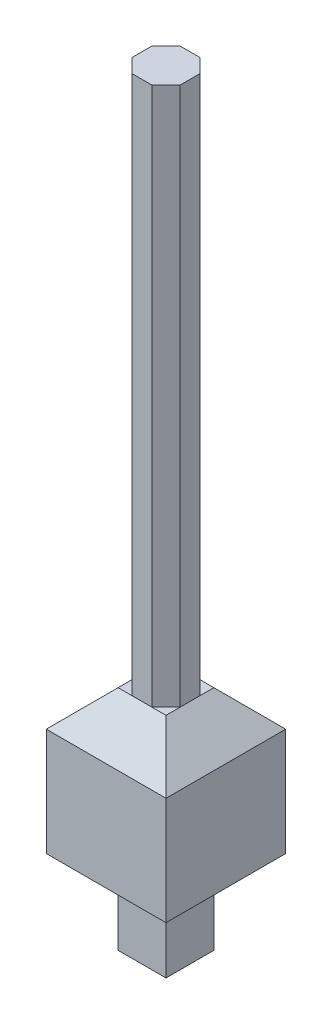
ISO-10303-21;
HEADER;
FILE_DESCRIPTION(('STEP AP214'),'2;1');
FILE_NAME('part.step','',(''),(''),'','','');
FILE_SCHEMA(('AUTOMOTIVE_DESIGN { 1 0 10303 214 1 1 1 1 }'));
ENDSEC;
DATA;
#1=APPLICATION_CONTEXT('core data for automotive mechanical design processes');
#2=APPLICATION_PROTOCOL_DEFINITION('international standard','automotive_design',2000,#1);
#3=PRODUCT_CONTEXT('',#1,'mechanical');
#4=PRODUCT('Part','Part','',(#3));
#5=PRODUCT_RELATED_PRODUCT_CATEGORY('part','',(#4));
#6=PRODUCT_DEFINITION_FORMATION('','',#4);
#7=PRODUCT_DEFINITION_CONTEXT('part definition',#1,'design');
#8=PRODUCT_DEFINITION('design','',#6,#7);
#9=PRODUCT_DEFINITION_SHAPE('','',#8);
#10=(LENGTH_UNIT() NAMED_UNIT(*) SI_UNIT(.MILLI.,.METRE.));
#11=(NAMED_UNIT(*) PLANE_ANGLE_UNIT() SI_UNIT($,.RADIAN.));
#12=(NAMED_UNIT(*) SI_UNIT($,.STERADIAN.) SOLID_ANGLE_UNIT());
#13=UNCERTAINTY_MEASURE_WITH_UNIT(LENGTH_MEASURE(1.E-05),#10,'distance_accuracy_value','');
#14=(GEOMETRIC_REPRESENTATION_CONTEXT(3) GLOBAL_UNCERTAINTY_ASSIGNED_CONTEXT((#13)) GLOBAL_UNIT_ASSIGNED_CONTEXT((#10,
#11,#12)) REPRESENTATION_CONTEXT('',''));
#15=CARTESIAN_POINT('',(0.,0.,0.));
#16=DIRECTION('',(0.,0.,1.));
#17=DIRECTION('',(1.,0.,0.));
#18=AXIS2_PLACEMENT_3D('',#15,#16,#17);
#19=CARTESIAN_POINT('',(0.,15.,0.));
#20=DIRECTION('',(0.,1.,0.));
#21=DIRECTION('',(0.,0.,1.));
#22=AXIS2_PLACEMENT_3D('',#19,#20,#21);
#23=PLANE('',#22);
#24=DIRECTION('',(0.707106781186557,0.,-0.707106781186538));
#25=VECTOR('',#24,1.);
#26=CARTESIAN_POINT('',(0.828427124746167,15.,2.00000000000002));
#27=LINE('',#26,#25);
#28=CARTESIAN_POINT('',(0.828427124746192,15.,2.));
#29=VERTEX_POINT('',#28);
#30=CARTESIAN_POINT('',(2.,15.,0.828427124746226));
#31=VERTEX_POINT('',#30);
#32=EDGE_CURVE('E184',#29,#31,#27,.T.);
#33=ORIENTED_EDGE('',*,*,#32,.F.);
#34=DIRECTION('',(1.,0.,0.));
#35=VECTOR('',#34,1.);
#36=CARTESIAN_POINT('',(5.,15.,2.));
#37=LINE('',#36,#35);
#38=CARTESIAN_POINT('',(2.,15.,2.));
#39=VERTEX_POINT('',#38);
#40=EDGE_CURVE('E254',#29,#39,#37,.T.);
#41=ORIENTED_EDGE('',*,*,#40,.T.);
#42=DIRECTION('',(0.,0.,-1.));
#43=VECTOR('',#42,1.);
#44=CARTESIAN_POINT('',(2.,15.,-5.));
#45=LINE('',#44,#43);
#46=EDGE_CURVE('E268',#39,#31,#45,.T.);
#47=ORIENTED_EDGE('',*,*,#46,.T.);
#48=EDGE_LOOP('',(#33,#41,#47));
#49=FACE_BOUND('',#48,.T.);
#50=ADVANCED_FACE('F37',(#49),#23,.T.);
#51=DIRECTION('',(0.707106781186538,0.,0.707106781186557));
#52=VECTOR('',#51,1.);
#53=CARTESIAN_POINT('',(-2.00000000000002,15.,0.828427124746166));
#54=LINE('',#53,#52);
#55=CARTESIAN_POINT('',(-2.,15.,0.828427124746192));
#56=VERTEX_POINT('',#55);
#57=CARTESIAN_POINT('',(-0.82842712474622,15.,2.));
#58=VERTEX_POINT('',#57);
#59=EDGE_CURVE('E338',#56,#58,#54,.T.);
#60=ORIENTED_EDGE('',*,*,#59,.F.);
#61=DIRECTION('',(0.,0.,1.));
#62=VECTOR('',#61,1.);
#63=CARTESIAN_POINT('',(-2.,15.,5.));
#64=LINE('',#63,#62);
#65=CARTESIAN_POINT('',(-2.,15.,2.));
#66=VERTEX_POINT('',#65);
#67=EDGE_CURVE('E273',#56,#66,#64,.T.);
#68=ORIENTED_EDGE('',*,*,#67,.T.);
#69=EDGE_CURVE('E264',#66,#58,#37,.T.);
#70=ORIENTED_EDGE('',*,*,#69,.T.);
#71=EDGE_LOOP('',(#60,#68,#70));
#72=FACE_BOUND('',#71,.T.);
#73=ADVANCED_FACE('F337',(#72),#23,.T.);
#74=DIRECTION('',(-0.707106781186557,0.,0.707106781186538));
#75=VECTOR('',#74,1.);
#76=CARTESIAN_POINT('',(-0.828427124746167,15.,-2.00000000000002));
#77=LINE('',#76,#75);
#78=CARTESIAN_POINT('',(-0.828427124746195,15.,-1.99999999999999));
#79=VERTEX_POINT('',#78);
#80=CARTESIAN_POINT('',(-2.,15.,-0.828427124746224));
#81=VERTEX_POINT('',#80);
#82=EDGE_CURVE('E372',#79,#81,#77,.T.);
#83=ORIENTED_EDGE('',*,*,#82,.F.);
#84=DIRECTION('',(-1.,0.,0.));
#85=VECTOR('',#84,1.);
#86=CARTESIAN_POINT('',(-5.,15.,-1.99999999999999));
#87=LINE('',#86,#85);
#88=CARTESIAN_POINT('',(-2.,15.,-1.99999999999999));
#89=VERTEX_POINT('',#88);
#90=EDGE_CURVE('E270',#79,#89,#87,.T.);
#91=ORIENTED_EDGE('',*,*,#90,.T.);
#92=EDGE_CURVE('E274',#89,#81,#64,.T.);
#93=ORIENTED_EDGE('',*,*,#92,.T.);
#94=EDGE_LOOP('',(#83,#91,#93));
#95=FACE_BOUND('',#94,.T.);
#96=ADVANCED_FACE('F408',(#95),#23,.T.);
#97=CARTESIAN_POINT('',(5.,8.,5.));
#98=DIRECTION('',(-1.,0.,0.));
#99=DIRECTION('',(0.,0.,1.));
#100=AXIS2_PLACEMENT_3D('',#97,#98,#99);
#101=PLANE('',#100);
#102=DIRECTION('',(0.,-1.,0.));
#103=VECTOR('',#102,1.);
#104=CARTESIAN_POINT('',(5.,8.,-5.));
#105=LINE('',#104,#103);
#106=CARTESIAN_POINT('',(5.,12.,-5.));
#107=VERTEX_POINT('',#106);
#108=CARTESIAN_POINT('',(5.,3.,-5.));
#109=VERTEX_POINT('',#108);
#110=EDGE_CURVE('E228',#107,#109,#105,.T.);
#111=ORIENTED_EDGE('',*,*,#110,.F.);
#112=DIRECTION('',(0.,0.,1.));
#113=VECTOR('',#112,1.);
#114=CARTESIAN_POINT('',(5.,12.,5.));
#115=LINE('',#114,#113);
#116=CARTESIAN_POINT('',(5.,12.,5.));
#117=VERTEX_POINT('',#116);
#118=EDGE_CURVE('E47',#107,#117,#115,.T.);
#119=ORIENTED_EDGE('',*,*,#118,.T.);
#120=DIRECTION('',(0.,-1.,0.));
#121=VECTOR('',#120,1.);
#122=CARTESIAN_POINT('',(5.,8.,5.));
#123=LINE('',#122,#121);
#124=CARTESIAN_POINT('',(5.,3.,5.));
#125=VERTEX_POINT('',#124);
#126=EDGE_CURVE('E221',#117,#125,#123,.T.);
#127=ORIENTED_EDGE('',*,*,#126,.T.);
#128=DIRECTION('',(0.,0.,-1.));
#129=VECTOR('',#128,1.);
#130=CARTESIAN_POINT('',(5.,3.,-5.));
#131=LINE('',#130,#129);
#132=EDGE_CURVE('E245',#125,#109,#131,.T.);
#133=ORIENTED_EDGE('',*,*,#132,.T.);
#134=EDGE_LOOP('',(#111,#119,#127,#133));
#135=FACE_BOUND('',#134,.T.);
#136=ADVANCED_FACE('F301',(#135),#101,.F.);
#137=CARTESIAN_POINT('',(-5.,8.,-5.));
#138=DIRECTION('',(0.,0.,1.));
#139=DIRECTION('',(1.,0.,0.));
#140=AXIS2_PLACEMENT_3D('',#137,#138,#139);
#141=PLANE('',#140);
#142=DIRECTION('',(0.,-1.,0.));
#143=VECTOR('',#142,1.);
#144=CARTESIAN_POINT('',(-5.,8.,-5.));
#145=LINE('',#144,#143);
#146=CARTESIAN_POINT('',(-5.,12.,-5.));
#147=VERTEX_POINT('',#146);
#148=CARTESIAN_POINT('',(-5.,3.,-5.));
#149=VERTEX_POINT('',#148);
#150=EDGE_CURVE('E226',#147,#149,#145,.T.);
#151=ORIENTED_EDGE('',*,*,#150,.F.);
#152=DIRECTION('',(1.,0.,0.));
#153=VECTOR('',#152,1.);
#154=CARTESIAN_POINT('',(5.,12.,-5.));
#155=LINE('',#154,#153);
#156=EDGE_CURVE('E280',#147,#107,#155,.T.);
#157=ORIENTED_EDGE('',*,*,#156,.T.);
#158=ORIENTED_EDGE('',*,*,#110,.T.);
#159=DIRECTION('',(-1.,0.,0.));
#160=VECTOR('',#159,1.);
#161=CARTESIAN_POINT('',(-5.,3.,-5.));
#162=LINE('',#161,#160);
#163=EDGE_CURVE('E248',#109,#149,#162,.T.);
#164=ORIENTED_EDGE('',*,*,#163,.T.);
#165=EDGE_LOOP('',(#151,#157,#158,#164));
#166=FACE_BOUND('',#165,.T.);
#167=ADVANCED_FACE('F322',(#166),#141,.F.);
#168=CARTESIAN_POINT('',(-5.,8.,5.));
#169=DIRECTION('',(1.,0.,0.));
#170=DIRECTION('',(0.,0.,-1.));
#171=AXIS2_PLACEMENT_3D('',#168,#169,#170);
#172=PLANE('',#171);
#173=DIRECTION('',(0.,-1.,0.));
#174=VECTOR('',#173,1.);
#175=CARTESIAN_POINT('',(-5.,8.,5.));
#176=LINE('',#175,#174);
#177=CARTESIAN_POINT('',(-5.,12.,5.));
#178=VERTEX_POINT('',#177);
#179=CARTESIAN_POINT('',(-5.,3.,5.));
#180=VERTEX_POINT('',#179);
#181=EDGE_CURVE('E223',#178,#180,#176,.T.);
#182=ORIENTED_EDGE('',*,*,#181,.F.);
#183=DIRECTION('',(0.,0.,-1.));
#184=VECTOR('',#183,1.);
#185=CARTESIAN_POINT('',(-5.,12.,-5.));
#186=LINE('',#185,#184);
#187=EDGE_CURVE('E277',#178,#147,#186,.T.);
#188=ORIENTED_EDGE('',*,*,#187,.T.);
#189=ORIENTED_EDGE('',*,*,#150,.T.);
#190=DIRECTION('',(0.,0.,1.));
#191=VECTOR('',#190,1.);
#192=CARTESIAN_POINT('',(-5.,3.,5.));
#193=LINE('',#192,#191);
#194=EDGE_CURVE('E251',#149,#180,#193,.T.);
#195=ORIENTED_EDGE('',*,*,#194,.T.);
#196=EDGE_LOOP('',(#182,#188,#189,#195));
#197=FACE_BOUND('',#196,.T.);
#198=ADVANCED_FACE('F324',(#197),#172,.F.);
#199=CARTESIAN_POINT('',(-5.,8.,5.));
#200=DIRECTION('',(0.,0.,-1.));
#201=DIRECTION('',(-1.,0.,0.));
#202=AXIS2_PLACEMENT_3D('',#199,#200,#201);
#203=PLANE('',#202);
#204=ORIENTED_EDGE('',*,*,#126,.F.);
#205=DIRECTION('',(-1.,0.,0.));
#206=VECTOR('',#205,1.);
#207=CARTESIAN_POINT('',(-5.,12.,5.));
#208=LINE('',#207,#206);
#209=EDGE_CURVE('E11',#117,#178,#208,.T.);
#210=ORIENTED_EDGE('',*,*,#209,.T.);
#211=ORIENTED_EDGE('',*,*,#181,.T.);
#212=DIRECTION('',(1.,0.,0.));
#213=VECTOR('',#212,1.);
#214=CARTESIAN_POINT('',(5.,3.,5.));
#215=LINE('',#214,#213);
#216=EDGE_CURVE('E230',#180,#125,#215,.T.);
#217=ORIENTED_EDGE('',*,*,#216,.T.);
#218=EDGE_LOOP('',(#204,#210,#211,#217));
#219=FACE_BOUND('',#218,.T.);
#220=ADVANCED_FACE('F303',(#219),#203,.F.);
#221=CARTESIAN_POINT('',(-5.,3.,-5.));
#222=DIRECTION('',(0.,-0.707106781186549,-0.707106781186546));
#223=DIRECTION('',(1.,0.,0.));
#224=AXIS2_PLACEMENT_3D('',#221,#222,#223);
#225=PLANE('',#224);
#226=DIRECTION('',(-0.577350269189626,-0.577350269189624,0.577350269189626));
#227=VECTOR('',#226,1.);
#228=CARTESIAN_POINT('',(1.66666666666666,-0.33333333333333,-1.66666666666666));
#229=LINE('',#228,#227);
#230=CARTESIAN_POINT('',(1.99999999999999,0.,-1.99999999999999));
#231=VERTEX_POINT('',#230);
#232=EDGE_CURVE('E259',#231,#109,#229,.F.);
#233=ORIENTED_EDGE('',*,*,#232,.F.);
#234=DIRECTION('',(1.,0.,0.));
#235=VECTOR('',#234,1.);
#236=CARTESIAN_POINT('',(5.,0.,-1.99999999999999));
#237=LINE('',#236,#235);
#238=CARTESIAN_POINT('',(-1.99999999999999,0.,-1.99999999999999));
#239=VERTEX_POINT('',#238);
#240=EDGE_CURVE('E236',#239,#231,#237,.T.);
#241=ORIENTED_EDGE('',*,*,#240,.F.);
#242=DIRECTION('',(0.577350269189626,-0.577350269189624,0.577350269189626));
#243=VECTOR('',#242,1.);
#244=CARTESIAN_POINT('',(-1.66666666666666,-0.33333333333333,-1.66666666666666));
#245=LINE('',#244,#243);
#246=EDGE_CURVE('E224',#149,#239,#245,.T.);
#247=ORIENTED_EDGE('',*,*,#246,.F.);
#248=ORIENTED_EDGE('',*,*,#163,.F.);
#249=EDGE_LOOP('',(#233,#241,#247,#248));
#250=FACE_BOUND('',#249,.T.);
#251=ADVANCED_FACE('F318',(#250),#225,.T.);
#252=CARTESIAN_POINT('',(-5.,3.,5.));
#253=DIRECTION('',(-0.707106781186546,-0.707106781186549,0.));
#254=DIRECTION('',(0.,0.,-1.));
#255=AXIS2_PLACEMENT_3D('',#252,#253,#254);
#256=PLANE('',#255);
#257=ORIENTED_EDGE('',*,*,#246,.T.);
#258=DIRECTION('',(0.,0.,-1.));
#259=VECTOR('',#258,1.);
#260=CARTESIAN_POINT('',(-1.99999999999999,0.,-5.));
#261=LINE('',#260,#259);
#262=CARTESIAN_POINT('',(-1.99999999999999,0.,1.99999999999999));
#263=VERTEX_POINT('',#262);
#264=EDGE_CURVE('E233',#263,#239,#261,.T.);
#265=ORIENTED_EDGE('',*,*,#264,.F.);
#266=DIRECTION('',(-0.577350269189626,0.577350269189624,0.577350269189626));
#267=VECTOR('',#266,1.);
#268=CARTESIAN_POINT('',(-5.,3.,5.));
#269=LINE('',#268,#267);
#270=EDGE_CURVE('E257',#180,#263,#269,.F.);
#271=ORIENTED_EDGE('',*,*,#270,.F.);
#272=ORIENTED_EDGE('',*,*,#194,.F.);
#273=EDGE_LOOP('',(#257,#265,#271,#272));
#274=FACE_BOUND('',#273,.T.);
#275=ADVANCED_FACE('F443',(#274),#256,.T.);
#276=CARTESIAN_POINT('',(5.,3.,5.));
#277=DIRECTION('',(0.707106781186546,-0.707106781186549,0.));
#278=DIRECTION('',(0.,0.,1.));
#279=AXIS2_PLACEMENT_3D('',#276,#277,#278);
#280=PLANE('',#279);
#281=ORIENTED_EDGE('',*,*,#232,.T.);
#282=ORIENTED_EDGE('',*,*,#132,.F.);
#283=DIRECTION('',(-0.577350269189626,-0.577350269189624,-0.577350269189626));
#284=VECTOR('',#283,1.);
#285=CARTESIAN_POINT('',(5.,3.,5.));
#286=LINE('',#285,#284);
#287=CARTESIAN_POINT('',(1.99999999999999,0.,1.99999999999999));
#288=VERTEX_POINT('',#287);
#289=EDGE_CURVE('E212',#288,#125,#286,.F.);
#290=ORIENTED_EDGE('',*,*,#289,.F.);
#291=DIRECTION('',(0.,0.,1.));
#292=VECTOR('',#291,1.);
#293=CARTESIAN_POINT('',(1.99999999999999,0.,5.));
#294=LINE('',#293,#292);
#295=EDGE_CURVE('E239',#231,#288,#294,.T.);
#296=ORIENTED_EDGE('',*,*,#295,.F.);
#297=EDGE_LOOP('',(#281,#282,#290,#296));
#298=FACE_BOUND('',#297,.T.);
#299=ADVANCED_FACE('F313',(#298),#280,.T.);
#300=CARTESIAN_POINT('',(-5.,3.,5.));
#301=DIRECTION('',(0.,-0.707106781186549,0.707106781186546));
#302=DIRECTION('',(-1.,0.,0.));
#303=AXIS2_PLACEMENT_3D('',#300,#301,#302);
#304=PLANE('',#303);
#305=ORIENTED_EDGE('',*,*,#270,.T.);
#306=DIRECTION('',(-1.,0.,0.));
#307=VECTOR('',#306,1.);
#308=CARTESIAN_POINT('',(-5.,0.,1.99999999999999));
#309=LINE('',#308,#307);
#310=EDGE_CURVE('E242',#288,#263,#309,.T.);
#311=ORIENTED_EDGE('',*,*,#310,.F.);
#312=ORIENTED_EDGE('',*,*,#289,.T.);
#313=ORIENTED_EDGE('',*,*,#216,.F.);
#314=EDGE_LOOP('',(#305,#311,#312,#313));
#315=FACE_BOUND('',#314,.T.);
#316=ADVANCED_FACE('F307',(#315),#304,.T.);
#317=CARTESIAN_POINT('',(-1.99999999999999,-4.,1.99999999999999));
#318=DIRECTION('',(0.,0.,1.));
#319=DIRECTION('',(1.,0.,0.));
#320=AXIS2_PLACEMENT_3D('',#317,#318,#319);
#321=PLANE('',#320);
#322=ORIENTED_EDGE('',*,*,#310,.T.);
#323=DIRECTION('',(0.,1.,0.));
#324=VECTOR('',#323,1.);
#325=CARTESIAN_POINT('',(-1.99999999999999,-4.,1.99999999999999));
#326=LINE('',#325,#324);
#327=CARTESIAN_POINT('',(-1.99999999999999,-4.,1.99999999999999));
#328=VERTEX_POINT('',#327);
#329=EDGE_CURVE('E209',#328,#263,#326,.T.);
#330=ORIENTED_EDGE('',*,*,#329,.F.);
#331=DIRECTION('',(1.,0.,0.));
#332=VECTOR('',#331,1.);
#333=CARTESIAN_POINT('',(-1.99999999999999,-4.,1.99999999999999));
#334=LINE('',#333,#332);
#335=CARTESIAN_POINT('',(1.99999999999999,-4.,1.99999999999999));
#336=VERTEX_POINT('',#335);
#337=EDGE_CURVE('E196',#328,#336,#334,.T.);
#338=ORIENTED_EDGE('',*,*,#337,.T.);
#339=DIRECTION('',(0.,1.,0.));
#340=VECTOR('',#339,1.);
#341=CARTESIAN_POINT('',(1.99999999999999,-4.,1.99999999999999));
#342=LINE('',#341,#340);
#343=EDGE_CURVE('E208',#336,#288,#342,.T.);
#344=ORIENTED_EDGE('',*,*,#343,.T.);
#345=EDGE_LOOP('',(#322,#330,#338,#344));
#346=FACE_BOUND('',#345,.T.);
#347=ADVANCED_FACE('F437',(#346),#321,.T.);
#348=CARTESIAN_POINT('',(-2.00000000000001,-4.,-1.99999999999999));
#349=DIRECTION('',(-1.,0.,0.));
#350=DIRECTION('',(0.,0.,1.));
#351=AXIS2_PLACEMENT_3D('',#348,#349,#350);
#352=PLANE('',#351);
#353=ORIENTED_EDGE('',*,*,#264,.T.);
#354=DIRECTION('',(0.,1.,0.));
#355=VECTOR('',#354,1.);
#356=CARTESIAN_POINT('',(-2.00000000000001,-4.,-1.99999999999999));
#357=LINE('',#356,#355);
#358=CARTESIAN_POINT('',(-2.00000000000001,-4.,-1.99999999999999));
#359=VERTEX_POINT('',#358);
#360=EDGE_CURVE('E213',#359,#239,#357,.T.);
#361=ORIENTED_EDGE('',*,*,#360,.F.);
#362=DIRECTION('',(0.,0.,1.));
#363=VECTOR('',#362,1.);
#364=CARTESIAN_POINT('',(-2.00000000000001,-4.,-1.99999999999999));
#365=LINE('',#364,#363);
#366=EDGE_CURVE('E205',#359,#328,#365,.T.);
#367=ORIENTED_EDGE('',*,*,#366,.T.);
#368=ORIENTED_EDGE('',*,*,#329,.T.);
#369=EDGE_LOOP('',(#353,#361,#367,#368));
#370=FACE_BOUND('',#369,.T.);
#371=ADVANCED_FACE('F634',(#370),#352,.T.);
#372=CARTESIAN_POINT('',(1.99999999999999,-4.,-1.99999999999999));
#373=DIRECTION('',(0.,0.,-1.));
#374=DIRECTION('',(-1.,0.,0.));
#375=AXIS2_PLACEMENT_3D('',#372,#373,#374);
#376=PLANE('',#375);
#377=ORIENTED_EDGE('',*,*,#240,.T.);
#378=DIRECTION('',(0.,1.,0.));
#379=VECTOR('',#378,1.);
#380=CARTESIAN_POINT('',(1.99999999999999,-4.,-1.99999999999999));
#381=LINE('',#380,#379);
#382=CARTESIAN_POINT('',(1.99999999999999,-4.,-1.99999999999999));
#383=VERTEX_POINT('',#382);
#384=EDGE_CURVE('E216',#383,#231,#381,.T.);
#385=ORIENTED_EDGE('',*,*,#384,.F.);
#386=DIRECTION('',(-1.,0.,0.));
#387=VECTOR('',#386,1.);
#388=CARTESIAN_POINT('',(1.99999999999999,-4.,-1.99999999999999));
#389=LINE('',#388,#387);
#390=EDGE_CURVE('E202',#383,#359,#389,.T.);
#391=ORIENTED_EDGE('',*,*,#390,.T.);
#392=ORIENTED_EDGE('',*,*,#360,.T.);
#393=EDGE_LOOP('',(#377,#385,#391,#392));
#394=FACE_BOUND('',#393,.T.);
#395=ADVANCED_FACE('F625',(#394),#376,.T.);
#396=CARTESIAN_POINT('',(1.99999999999999,-4.,1.99999999999999));
#397=DIRECTION('',(1.,0.,0.));
#398=DIRECTION('',(0.,0.,-1.));
#399=AXIS2_PLACEMENT_3D('',#396,#397,#398);
#400=PLANE('',#399);
#401=ORIENTED_EDGE('',*,*,#295,.T.);
#402=ORIENTED_EDGE('',*,*,#343,.F.);
#403=DIRECTION('',(0.,0.,-1.));
#404=VECTOR('',#403,1.);
#405=CARTESIAN_POINT('',(1.99999999999999,-4.,1.99999999999999));
#406=LINE('',#405,#404);
#407=EDGE_CURVE('E199',#336,#383,#406,.T.);
#408=ORIENTED_EDGE('',*,*,#407,.T.);
#409=ORIENTED_EDGE('',*,*,#384,.T.);
#410=EDGE_LOOP('',(#401,#402,#408,#409));
#411=FACE_BOUND('',#410,.T.);
#412=ADVANCED_FACE('F417',(#411),#400,.T.);
#413=CARTESIAN_POINT('',(0.,-4.,0.));
#414=DIRECTION('',(0.,1.,0.));
#415=DIRECTION('',(0.,0.,1.));
#416=AXIS2_PLACEMENT_3D('',#413,#414,#415);
#417=PLANE('',#416);
#418=ORIENTED_EDGE('',*,*,#337,.F.);
#419=ORIENTED_EDGE('',*,*,#366,.F.);
#420=ORIENTED_EDGE('',*,*,#390,.F.);
#421=ORIENTED_EDGE('',*,*,#407,.F.);
#422=EDGE_LOOP('',(#418,#419,#420,#421));
#423=FACE_BOUND('',#422,.T.);
#424=ADVANCED_FACE('F412',(#423),#417,.F.);
#425=DIRECTION('',(-0.707106781186538,0.,-0.707106781186557));
#426=VECTOR('',#425,1.);
#427=CARTESIAN_POINT('',(2.00000000000002,15.,-0.828427124746168));
#428=LINE('',#427,#426);
#429=CARTESIAN_POINT('',(2.,15.,-0.828427124746192));
#430=VERTEX_POINT('',#429);
#431=CARTESIAN_POINT('',(0.828427124746222,15.,-2.));
#432=VERTEX_POINT('',#431);
#433=EDGE_CURVE('E55',#430,#432,#428,.T.);
#434=ORIENTED_EDGE('',*,*,#433,.F.);
#435=CARTESIAN_POINT('',(2.,15.,-1.99999999999999));
#436=VERTEX_POINT('',#435);
#437=EDGE_CURVE('E267',#430,#436,#45,.T.);
#438=ORIENTED_EDGE('',*,*,#437,.T.);
#439=EDGE_CURVE('E271',#436,#432,#87,.T.);
#440=ORIENTED_EDGE('',*,*,#439,.T.);
#441=EDGE_LOOP('',(#434,#438,#440));
#442=FACE_BOUND('',#441,.T.);
#443=ADVANCED_FACE('F404',(#442),#23,.T.);
#444=CARTESIAN_POINT('',(2.,15.,0.));
#445=DIRECTION('',(0.707106781186549,0.707106781186546,0.));
#446=DIRECTION('',(0.,0.,1.));
#447=AXIS2_PLACEMENT_3D('',#444,#445,#446);
#448=PLANE('',#447);
#449=DIRECTION('',(-0.577350269189625,0.577350269189628,-0.577350269189625));
#450=VECTOR('',#449,1.);
#451=CARTESIAN_POINT('',(1.33333333333333,15.6666666666667,1.33333333333333));
#452=LINE('',#451,#450);
#453=EDGE_CURVE('E283',#117,#39,#452,.T.);
#454=ORIENTED_EDGE('',*,*,#453,.F.);
#455=ORIENTED_EDGE('',*,*,#118,.F.);
#456=DIRECTION('',(-0.577350269189625,0.577350269189628,0.577350269189625));
#457=VECTOR('',#456,1.);
#458=CARTESIAN_POINT('',(1.33333333333334,15.6666666666667,-1.33333333333333));
#459=LINE('',#458,#457);
#460=EDGE_CURVE('E42',#436,#107,#459,.F.);
#461=ORIENTED_EDGE('',*,*,#460,.F.);
#462=ORIENTED_EDGE('',*,*,#437,.F.);
#463=DIRECTION('',(0.,0.,-1.));
#464=VECTOR('',#463,1.);
#465=CARTESIAN_POINT('',(2.,15.,0.828427124746222));
#466=LINE('',#465,#464);
#467=EDGE_CURVE('E62',#31,#430,#466,.T.);
#468=ORIENTED_EDGE('',*,*,#467,.F.);
#469=ORIENTED_EDGE('',*,*,#46,.F.);
#470=EDGE_LOOP('',(#454,#455,#461,#462,#468,#469));
#471=FACE_BOUND('',#470,.T.);
#472=ADVANCED_FACE('F40',(#471),#448,.T.);
#473=CARTESIAN_POINT('',(0.,15.,-1.99999999999999));
#474=DIRECTION('',(0.,0.707106781186546,-0.707106781186549));
#475=DIRECTION('',(1.,0.,0.));
#476=AXIS2_PLACEMENT_3D('',#473,#474,#475);
#477=PLANE('',#476);
#478=ORIENTED_EDGE('',*,*,#460,.T.);
#479=ORIENTED_EDGE('',*,*,#156,.F.);
#480=DIRECTION('',(0.577350269189625,0.577350269189628,0.577350269189625));
#481=VECTOR('',#480,1.);
#482=CARTESIAN_POINT('',(-1.33333333333333,15.6666666666667,-1.33333333333333));
#483=LINE('',#482,#481);
#484=EDGE_CURVE('E190',#89,#147,#483,.F.);
#485=ORIENTED_EDGE('',*,*,#484,.F.);
#486=ORIENTED_EDGE('',*,*,#90,.F.);
#487=DIRECTION('',(-1.,0.,0.));
#488=VECTOR('',#487,1.);
#489=CARTESIAN_POINT('',(0.828427124746222,15.,-2.));
#490=LINE('',#489,#488);
#491=EDGE_CURVE('E377',#432,#79,#490,.T.);
#492=ORIENTED_EDGE('',*,*,#491,.F.);
#493=ORIENTED_EDGE('',*,*,#439,.F.);
#494=EDGE_LOOP('',(#478,#479,#485,#486,#492,#493));
#495=FACE_BOUND('',#494,.T.);
#496=ADVANCED_FACE('F294',(#495),#477,.T.);
#497=CARTESIAN_POINT('',(0.,15.,2.));
#498=DIRECTION('',(0.,0.707106781186546,0.707106781186549));
#499=DIRECTION('',(-1.,0.,0.));
#500=AXIS2_PLACEMENT_3D('',#497,#498,#499);
#501=PLANE('',#500);
#502=ORIENTED_EDGE('',*,*,#453,.T.);
#503=ORIENTED_EDGE('',*,*,#40,.F.);
#504=DIRECTION('',(1.,0.,0.));
#505=VECTOR('',#504,1.);
#506=CARTESIAN_POINT('',(-0.828427124746218,15.,2.));
#507=LINE('',#506,#505);
#508=EDGE_CURVE('E334',#58,#29,#507,.T.);
#509=ORIENTED_EDGE('',*,*,#508,.F.);
#510=ORIENTED_EDGE('',*,*,#69,.F.);
#511=DIRECTION('',(-0.577350269189625,-0.577350269189628,0.577350269189625));
#512=VECTOR('',#511,1.);
#513=CARTESIAN_POINT('',(-1.33333333333333,15.6666666666667,1.33333333333333));
#514=LINE('',#513,#512);
#515=EDGE_CURVE('E187',#178,#66,#514,.F.);
#516=ORIENTED_EDGE('',*,*,#515,.F.);
#517=ORIENTED_EDGE('',*,*,#209,.F.);
#518=EDGE_LOOP('',(#502,#503,#509,#510,#516,#517));
#519=FACE_BOUND('',#518,.T.);
#520=ADVANCED_FACE('F332',(#519),#501,.T.);
#521=CARTESIAN_POINT('',(-2.,15.,0.));
#522=DIRECTION('',(-0.707106781186549,0.707106781186546,0.));
#523=DIRECTION('',(0.,0.,-1.));
#524=AXIS2_PLACEMENT_3D('',#521,#522,#523);
#525=PLANE('',#524);
#526=ORIENTED_EDGE('',*,*,#484,.T.);
#527=ORIENTED_EDGE('',*,*,#187,.F.);
#528=ORIENTED_EDGE('',*,*,#515,.T.);
#529=ORIENTED_EDGE('',*,*,#67,.F.);
#530=DIRECTION('',(0.,0.,1.));
#531=VECTOR('',#530,1.);
#532=CARTESIAN_POINT('',(-2.,15.,-0.828427124746222));
#533=LINE('',#532,#531);
#534=EDGE_CURVE('E349',#81,#56,#533,.T.);
#535=ORIENTED_EDGE('',*,*,#534,.F.);
#536=ORIENTED_EDGE('',*,*,#92,.F.);
#537=EDGE_LOOP('',(#526,#527,#528,#529,#535,#536));
#538=FACE_BOUND('',#537,.T.);
#539=ADVANCED_FACE('F328',(#538),#525,.T.);
#540=CARTESIAN_POINT('',(2.,60.,0.828427124746222));
#541=DIRECTION('',(-1.,0.,0.));
#542=DIRECTION('',(0.,0.,1.));
#543=AXIS2_PLACEMENT_3D('',#540,#541,#542);
#544=PLANE('',#543);
#545=ORIENTED_EDGE('',*,*,#467,.T.);
#546=DIRECTION('',(0.,-1.,0.));
#547=VECTOR('',#546,1.);
#548=CARTESIAN_POINT('',(2.00000000000002,60.,-0.828427124746168));
#549=LINE('',#548,#547);
#550=CARTESIAN_POINT('',(2.00000000000002,60.,-0.828427124746168));
#551=VERTEX_POINT('',#550);
#552=EDGE_CURVE('E169',#551,#430,#549,.T.);
#553=ORIENTED_EDGE('',*,*,#552,.F.);
#554=DIRECTION('',(0.,0.,-1.));
#555=VECTOR('',#554,1.);
#556=CARTESIAN_POINT('',(2.,60.,0.828427124746222));
#557=LINE('',#556,#555);
#558=CARTESIAN_POINT('',(2.,60.,0.828427124746222));
#559=VERTEX_POINT('',#558);
#560=EDGE_CURVE('E175',#559,#551,#557,.T.);
#561=ORIENTED_EDGE('',*,*,#560,.F.);
#562=DIRECTION('',(0.,-1.,0.));
#563=VECTOR('',#562,1.);
#564=CARTESIAN_POINT('',(2.,60.,0.828427124746222));
#565=LINE('',#564,#563);
#566=EDGE_CURVE('E360',#559,#31,#565,.T.);
#567=ORIENTED_EDGE('',*,*,#566,.T.);
#568=EDGE_LOOP('',(#545,#553,#561,#567));
#569=FACE_BOUND('',#568,.T.);
#570=ADVANCED_FACE('F186',(#569),#544,.F.);
#571=CARTESIAN_POINT('',(2.00000000000002,60.,-0.828427124746168));
#572=DIRECTION('',(-0.707106781186557,0.,0.707106781186538));
#573=DIRECTION('',(0.707106781186538,0.,0.707106781186557));
#574=AXIS2_PLACEMENT_3D('',#571,#572,#573);
#575=PLANE('',#574);
#576=ORIENTED_EDGE('',*,*,#433,.T.);
#577=DIRECTION('',(0.,-1.,0.));
#578=VECTOR('',#577,1.);
#579=CARTESIAN_POINT('',(0.828427124746222,60.,-2.));
#580=LINE('',#579,#578);
#581=CARTESIAN_POINT('',(0.828427124746222,60.,-2.));
#582=VERTEX_POINT('',#581);
#583=EDGE_CURVE('E171',#582,#432,#580,.T.);
#584=ORIENTED_EDGE('',*,*,#583,.F.);
#585=DIRECTION('',(-0.707106781186538,0.,-0.707106781186557));
#586=VECTOR('',#585,1.);
#587=CARTESIAN_POINT('',(2.00000000000002,60.,-0.828427124746168));
#588=LINE('',#587,#586);
#589=EDGE_CURVE('E165',#551,#582,#588,.T.);
#590=ORIENTED_EDGE('',*,*,#589,.F.);
#591=ORIENTED_EDGE('',*,*,#552,.T.);
#592=EDGE_LOOP('',(#576,#584,#590,#591));
#593=FACE_BOUND('',#592,.T.);
#594=ADVANCED_FACE('F167',(#593),#575,.F.);
#595=CARTESIAN_POINT('',(0.828427124746222,60.,-2.));
#596=DIRECTION('',(0.,0.,1.));
#597=DIRECTION('',(1.,0.,0.));
#598=AXIS2_PLACEMENT_3D('',#595,#596,#597);
#599=PLANE('',#598);
#600=ORIENTED_EDGE('',*,*,#491,.T.);
#601=DIRECTION('',(0.,-1.,0.));
#602=VECTOR('',#601,1.);
#603=CARTESIAN_POINT('',(-0.828427124746167,60.,-2.00000000000002));
#604=LINE('',#603,#602);
#605=CARTESIAN_POINT('',(-0.828427124746167,60.,-2.00000000000002));
#606=VERTEX_POINT('',#605);
#607=EDGE_CURVE('E192',#606,#79,#604,.T.);
#608=ORIENTED_EDGE('',*,*,#607,.F.);
#609=DIRECTION('',(-1.,0.,0.));
#610=VECTOR('',#609,1.);
#611=CARTESIAN_POINT('',(0.828427124746222,60.,-2.));
#612=LINE('',#611,#610);
#613=EDGE_CURVE('E174',#582,#606,#612,.T.);
#614=ORIENTED_EDGE('',*,*,#613,.F.);
#615=ORIENTED_EDGE('',*,*,#583,.T.);
#616=EDGE_LOOP('',(#600,#608,#614,#615));
#617=FACE_BOUND('',#616,.T.);
#618=ADVANCED_FACE('F376',(#617),#599,.F.);
#619=CARTESIAN_POINT('',(-0.828427124746167,60.,-2.00000000000002));
#620=DIRECTION('',(0.707106781186538,0.,0.707106781186557));
#621=DIRECTION('',(0.707106781186557,0.,-0.707106781186538));
#622=AXIS2_PLACEMENT_3D('',#619,#620,#621);
#623=PLANE('',#622);
#624=ORIENTED_EDGE('',*,*,#82,.T.);
#625=DIRECTION('',(0.,-1.,0.));
#626=VECTOR('',#625,1.);
#627=CARTESIAN_POINT('',(-2.,60.,-0.828427124746222));
#628=LINE('',#627,#626);
#629=CARTESIAN_POINT('',(-2.,60.,-0.828427124746222));
#630=VERTEX_POINT('',#629);
#631=EDGE_CURVE('E358',#630,#81,#628,.T.);
#632=ORIENTED_EDGE('',*,*,#631,.F.);
#633=DIRECTION('',(-0.707106781186557,0.,0.707106781186538));
#634=VECTOR('',#633,1.);
#635=CARTESIAN_POINT('',(-0.828427124746167,60.,-2.00000000000002));
#636=LINE('',#635,#634);
#637=EDGE_CURVE('E373',#606,#630,#636,.T.);
#638=ORIENTED_EDGE('',*,*,#637,.F.);
#639=ORIENTED_EDGE('',*,*,#607,.T.);
#640=EDGE_LOOP('',(#624,#632,#638,#639));
#641=FACE_BOUND('',#640,.T.);
#642=ADVANCED_FACE('F370',(#641),#623,.F.);
#643=CARTESIAN_POINT('',(-2.,60.,-0.828427124746222));
#644=DIRECTION('',(1.,0.,0.));
#645=DIRECTION('',(0.,0.,-1.));
#646=AXIS2_PLACEMENT_3D('',#643,#644,#645);
#647=PLANE('',#646);
#648=ORIENTED_EDGE('',*,*,#534,.T.);
#649=DIRECTION('',(0.,-1.,0.));
#650=VECTOR('',#649,1.);
#651=CARTESIAN_POINT('',(-2.00000000000002,60.,0.828427124746166));
#652=LINE('',#651,#650);
#653=CARTESIAN_POINT('',(-2.00000000000002,60.,0.828427124746166));
#654=VERTEX_POINT('',#653);
#655=EDGE_CURVE('E348',#654,#56,#652,.T.);
#656=ORIENTED_EDGE('',*,*,#655,.F.);
#657=DIRECTION('',(0.,0.,1.));
#658=VECTOR('',#657,1.);
#659=CARTESIAN_POINT('',(-2.,60.,-0.828427124746222));
#660=LINE('',#659,#658);
#661=EDGE_CURVE('E393',#630,#654,#660,.T.);
#662=ORIENTED_EDGE('',*,*,#661,.F.);
#663=ORIENTED_EDGE('',*,*,#631,.T.);
#664=EDGE_LOOP('',(#648,#656,#662,#663));
#665=FACE_BOUND('',#664,.T.);
#666=ADVANCED_FACE('F398',(#665),#647,.F.);
#667=CARTESIAN_POINT('',(-2.00000000000002,60.,0.828427124746166));
#668=DIRECTION('',(0.707106781186557,0.,-0.707106781186538));
#669=DIRECTION('',(-0.707106781186538,0.,-0.707106781186557));
#670=AXIS2_PLACEMENT_3D('',#667,#668,#669);
#671=PLANE('',#670);
#672=ORIENTED_EDGE('',*,*,#59,.T.);
#673=DIRECTION('',(0.,-1.,0.));
#674=VECTOR('',#673,1.);
#675=CARTESIAN_POINT('',(-0.828427124746218,60.,2.));
#676=LINE('',#675,#674);
#677=CARTESIAN_POINT('',(-0.828427124746218,60.,2.));
#678=VERTEX_POINT('',#677);
#679=EDGE_CURVE('E345',#678,#58,#676,.T.);
#680=ORIENTED_EDGE('',*,*,#679,.F.);
#681=DIRECTION('',(0.707106781186538,0.,0.707106781186557));
#682=VECTOR('',#681,1.);
#683=CARTESIAN_POINT('',(-2.00000000000002,60.,0.828427124746166));
#684=LINE('',#683,#682);
#685=EDGE_CURVE('E389',#654,#678,#684,.T.);
#686=ORIENTED_EDGE('',*,*,#685,.F.);
#687=ORIENTED_EDGE('',*,*,#655,.T.);
#688=EDGE_LOOP('',(#672,#680,#686,#687));
#689=FACE_BOUND('',#688,.T.);
#690=ADVANCED_FACE('F343',(#689),#671,.F.);
#691=CARTESIAN_POINT('',(-0.828427124746218,60.,2.));
#692=DIRECTION('',(0.,0.,-1.));
#693=DIRECTION('',(-1.,0.,0.));
#694=AXIS2_PLACEMENT_3D('',#691,#692,#693);
#695=PLANE('',#694);
#696=ORIENTED_EDGE('',*,*,#508,.T.);
#697=DIRECTION('',(0.,-1.,0.));
#698=VECTOR('',#697,1.);
#699=CARTESIAN_POINT('',(0.828427124746167,60.,2.00000000000002));
#700=LINE('',#699,#698);
#701=CARTESIAN_POINT('',(0.828427124746167,60.,2.00000000000002));
#702=VERTEX_POINT('',#701);
#703=EDGE_CURVE('E356',#702,#29,#700,.T.);
#704=ORIENTED_EDGE('',*,*,#703,.F.);
#705=DIRECTION('',(1.,0.,0.));
#706=VECTOR('',#705,1.);
#707=CARTESIAN_POINT('',(-0.828427124746218,60.,2.));
#708=LINE('',#707,#706);
#709=EDGE_CURVE('E355',#678,#702,#708,.T.);
#710=ORIENTED_EDGE('',*,*,#709,.F.);
#711=ORIENTED_EDGE('',*,*,#679,.T.);
#712=EDGE_LOOP('',(#696,#704,#710,#711));
#713=FACE_BOUND('',#712,.T.);
#714=ADVANCED_FACE('F352',(#713),#695,.F.);
#715=CARTESIAN_POINT('',(0.828427124746167,60.,2.00000000000002));
#716=DIRECTION('',(-0.707106781186538,0.,-0.707106781186557));
#717=DIRECTION('',(-0.707106781186557,0.,0.707106781186538));
#718=AXIS2_PLACEMENT_3D('',#715,#716,#717);
#719=PLANE('',#718);
#720=ORIENTED_EDGE('',*,*,#32,.T.);
#721=ORIENTED_EDGE('',*,*,#566,.F.);
#722=DIRECTION('',(0.707106781186557,0.,-0.707106781186538));
#723=VECTOR('',#722,1.);
#724=CARTESIAN_POINT('',(0.828427124746167,60.,2.00000000000002));
#725=LINE('',#724,#723);
#726=EDGE_CURVE('E180',#702,#559,#725,.T.);
#727=ORIENTED_EDGE('',*,*,#726,.F.);
#728=ORIENTED_EDGE('',*,*,#703,.T.);
#729=EDGE_LOOP('',(#720,#721,#727,#728));
#730=FACE_BOUND('',#729,.T.);
#731=ADVANCED_FACE('F400',(#730),#719,.F.);
#732=CARTESIAN_POINT('',(0.,60.,0.));
#733=DIRECTION('',(0.,1.,0.));
#734=DIRECTION('',(0.,0.,1.));
#735=AXIS2_PLACEMENT_3D('',#732,#733,#734);
#736=PLANE('',#735);
#737=ORIENTED_EDGE('',*,*,#560,.T.);
#738=ORIENTED_EDGE('',*,*,#589,.T.);
#739=ORIENTED_EDGE('',*,*,#613,.T.);
#740=ORIENTED_EDGE('',*,*,#637,.T.);
#741=ORIENTED_EDGE('',*,*,#661,.T.);
#742=ORIENTED_EDGE('',*,*,#685,.T.);
#743=ORIENTED_EDGE('',*,*,#709,.T.);
#744=ORIENTED_EDGE('',*,*,#726,.T.);
#745=EDGE_LOOP('',(#737,#738,#739,#740,#741,#742,#743,#744));
#746=FACE_BOUND('',#745,.T.);
#747=ADVANCED_FACE('F178',(#746),#736,.T.);
#748=CLOSED_SHELL('',(#50,#73,#96,#136,#167,#198,#220,#251,#275,#299,#316,#347,#371,#395,#412,
#424,#443,#472,#496,#520,#539,#570,#594,#618,#642,#666,#690,#714,#731,#747));
#749=MANIFOLD_SOLID_BREP('B2',#748);
#750=ADVANCED_BREP_SHAPE_REPRESENTATION('',(#18,#749),#14);
#751=SHAPE_DEFINITION_REPRESENTATION(#9,#750);
ENDSEC;
END-ISO-10303-21;
